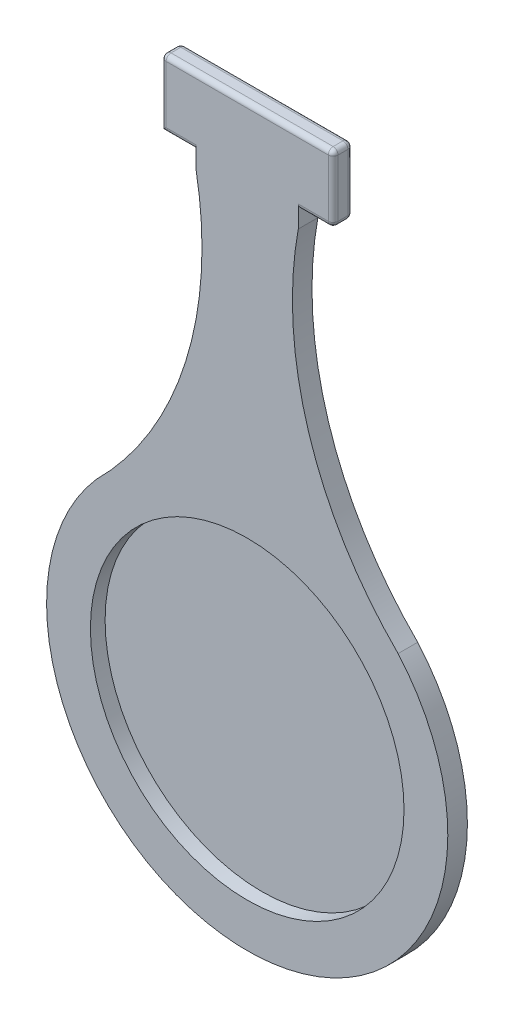
ISO-10303-21;
HEADER;
FILE_DESCRIPTION(('STEP AP214'),'2;1');
FILE_NAME('part.step','',(''),(''),'','','');
FILE_SCHEMA(('AUTOMOTIVE_DESIGN { 1 0 10303 214 1 1 1 1 }'));
ENDSEC;
DATA;
#1=APPLICATION_CONTEXT('core data for automotive mechanical design processes');
#2=APPLICATION_PROTOCOL_DEFINITION('international standard','automotive_design',2000,#1);
#3=PRODUCT_CONTEXT('',#1,'mechanical');
#4=PRODUCT('Part','Part','',(#3));
#5=PRODUCT_RELATED_PRODUCT_CATEGORY('part','',(#4));
#6=PRODUCT_DEFINITION_FORMATION('','',#4);
#7=PRODUCT_DEFINITION_CONTEXT('part definition',#1,'design');
#8=PRODUCT_DEFINITION('design','',#6,#7);
#9=PRODUCT_DEFINITION_SHAPE('','',#8);
#10=(LENGTH_UNIT() NAMED_UNIT(*) SI_UNIT(.MILLI.,.METRE.));
#11=(NAMED_UNIT(*) PLANE_ANGLE_UNIT() SI_UNIT($,.RADIAN.));
#12=(NAMED_UNIT(*) SI_UNIT($,.STERADIAN.) SOLID_ANGLE_UNIT());
#13=UNCERTAINTY_MEASURE_WITH_UNIT(LENGTH_MEASURE(1.E-05),#10,'distance_accuracy_value','');
#14=(GEOMETRIC_REPRESENTATION_CONTEXT(3) GLOBAL_UNCERTAINTY_ASSIGNED_CONTEXT((#13)) GLOBAL_UNIT_ASSIGNED_CONTEXT((#10,
#11,#12)) REPRESENTATION_CONTEXT('',''));
#15=CARTESIAN_POINT('',(0.,0.,0.));
#16=DIRECTION('',(0.,0.,1.));
#17=DIRECTION('',(1.,0.,0.));
#18=AXIS2_PLACEMENT_3D('',#15,#16,#17);
#19=CARTESIAN_POINT('',(81.9477550151051,78.6670750611456,4.));
#20=DIRECTION('',(0.,0.,-1.));
#21=DIRECTION('',(-1.,0.,0.));
#22=AXIS2_PLACEMENT_3D('',#19,#20,#21);
#23=CYLINDRICAL_SURFACE('',#22,72.7227759277008);
#24=CARTESIAN_POINT('',(81.9477550151051,78.6670750611456,0.));
#25=DIRECTION('',(0.,0.,-1.));
#26=DIRECTION('',(-1.,0.,0.));
#27=AXIS2_PLACEMENT_3D('',#24,#25,#26);
#28=CIRCLE('',#27,72.7227759277008);
#29=CARTESIAN_POINT('',(30.7940028537095,26.9766912509909,0.));
#30=VERTEX_POINT('',#29);
#31=CARTESIAN_POINT('',(10.4264337058282,91.8315247954017,0.));
#32=VERTEX_POINT('',#31);
#33=EDGE_CURVE('E195',#30,#32,#28,.T.);
#34=ORIENTED_EDGE('',*,*,#33,.T.);
#35=DIRECTION('',(0.,0.,-1.));
#36=VECTOR('',#35,1.);
#37=CARTESIAN_POINT('',(10.4264337058282,91.8315247954017,4.));
#38=LINE('',#37,#36);
#39=CARTESIAN_POINT('',(10.4264337058282,91.8315247954017,4.));
#40=VERTEX_POINT('',#39);
#41=EDGE_CURVE('E174',#40,#32,#38,.T.);
#42=ORIENTED_EDGE('',*,*,#41,.F.);
#43=CARTESIAN_POINT('',(81.9477550151051,78.6670750611456,4.));
#44=DIRECTION('',(0.,0.,-1.));
#45=DIRECTION('',(-1.,0.,0.));
#46=AXIS2_PLACEMENT_3D('',#43,#44,#45);
#47=CIRCLE('',#46,72.7227759277008);
#48=CARTESIAN_POINT('',(30.7940028537095,26.9766912509909,4.));
#49=VERTEX_POINT('',#48);
#50=EDGE_CURVE('E182',#49,#40,#47,.T.);
#51=ORIENTED_EDGE('',*,*,#50,.F.);
#52=DIRECTION('',(0.,0.,-1.));
#53=VECTOR('',#52,1.);
#54=CARTESIAN_POINT('',(30.7940028537095,26.9766912509909,4.));
#55=LINE('',#54,#53);
#56=EDGE_CURVE('E358',#49,#30,#55,.T.);
#57=ORIENTED_EDGE('',*,*,#56,.T.);
#58=EDGE_LOOP('',(#34,#42,#51,#57));
#59=FACE_BOUND('',#58,.T.);
#60=ADVANCED_FACE('F37',(#59),#23,.F.);
#61=CARTESIAN_POINT('',(10.4264337058282,91.8315247954017,4.));
#62=DIRECTION('',(-1.,0.,0.));
#63=DIRECTION('',(0.,-1.,0.));
#64=AXIS2_PLACEMENT_3D('',#61,#62,#63);
#65=PLANE('',#64);
#66=DIRECTION('',(0.,1.,0.));
#67=VECTOR('',#66,1.);
#68=CARTESIAN_POINT('',(10.4264337058282,91.8315247954017,0.));
#69=LINE('',#68,#67);
#70=CARTESIAN_POINT('',(10.4264337058282,96.2580756220526,0.));
#71=VERTEX_POINT('',#70);
#72=EDGE_CURVE('E346',#32,#71,#69,.T.);
#73=ORIENTED_EDGE('',*,*,#72,.T.);
#74=CARTESIAN_POINT('',(10.4264337058282,96.2580756220526,1.));
#75=DIRECTION('',(-1.,0.,0.));
#76=DIRECTION('',(0.,-1.,0.));
#77=AXIS2_PLACEMENT_3D('',#74,#75,#76);
#78=CIRCLE('',#77,1.);
#79=CARTESIAN_POINT('',(10.4264337058282,95.2580756220526,1.));
#80=VERTEX_POINT('',#79);
#81=EDGE_CURVE('E260',#71,#80,#78,.T.);
#82=ORIENTED_EDGE('',*,*,#81,.T.);
#83=DIRECTION('',(0.,0.,-1.));
#84=VECTOR('',#83,1.);
#85=CARTESIAN_POINT('',(10.4264337058282,95.2580756220526,4.));
#86=LINE('',#85,#84);
#87=CARTESIAN_POINT('',(10.4264337058282,95.2580756220526,3.));
#88=VERTEX_POINT('',#87);
#89=EDGE_CURVE('E197',#88,#80,#86,.T.);
#90=ORIENTED_EDGE('',*,*,#89,.F.);
#91=CARTESIAN_POINT('',(10.4264337058282,96.2580756220526,3.));
#92=DIRECTION('',(-1.,0.,0.));
#93=DIRECTION('',(0.,-1.,0.));
#94=AXIS2_PLACEMENT_3D('',#91,#92,#93);
#95=CIRCLE('',#94,1.);
#96=CARTESIAN_POINT('',(10.4264337058282,96.2580756220526,4.));
#97=VERTEX_POINT('',#96);
#98=EDGE_CURVE('E178',#88,#97,#95,.T.);
#99=ORIENTED_EDGE('',*,*,#98,.T.);
#100=DIRECTION('',(0.,1.,0.));
#101=VECTOR('',#100,1.);
#102=CARTESIAN_POINT('',(10.4264337058282,91.8315247954017,4.));
#103=LINE('',#102,#101);
#104=EDGE_CURVE('E170',#40,#97,#103,.T.);
#105=ORIENTED_EDGE('',*,*,#104,.F.);
#106=ORIENTED_EDGE('',*,*,#41,.T.);
#107=EDGE_LOOP('',(#73,#82,#90,#99,#105,#106));
#108=FACE_BOUND('',#107,.T.);
#109=ADVANCED_FACE('F172',(#108),#65,.F.);
#110=CARTESIAN_POINT('',(10.4264337058282,95.2580756220526,4.));
#111=DIRECTION('',(0.,1.,0.));
#112=DIRECTION('',(0.,0.,1.));
#113=AXIS2_PLACEMENT_3D('',#110,#111,#112);
#114=PLANE('',#113);
#115=ORIENTED_EDGE('',*,*,#89,.T.);
#116=DIRECTION('',(1.,0.,0.));
#117=VECTOR('',#116,1.);
#118=CARTESIAN_POINT('',(17.5473838536535,95.2580756220526,1.));
#119=LINE('',#118,#117);
#120=CARTESIAN_POINT('',(16.5473838536535,95.2580756220526,1.));
#121=VERTEX_POINT('',#120);
#122=EDGE_CURVE('E236',#80,#121,#119,.T.);
#123=ORIENTED_EDGE('',*,*,#122,.T.);
#124=DIRECTION('',(0.,0.,-1.));
#125=VECTOR('',#124,1.);
#126=CARTESIAN_POINT('',(16.5473838536535,95.2580756220526,4.));
#127=LINE('',#126,#125);
#128=CARTESIAN_POINT('',(16.5473838536535,95.2580756220526,3.));
#129=VERTEX_POINT('',#128);
#130=EDGE_CURVE('E232',#121,#129,#127,.F.);
#131=ORIENTED_EDGE('',*,*,#130,.T.);
#132=DIRECTION('',(1.,0.,0.));
#133=VECTOR('',#132,1.);
#134=CARTESIAN_POINT('',(10.4264337058282,95.2580756220526,3.));
#135=LINE('',#134,#133);
#136=EDGE_CURVE('E234',#129,#88,#135,.F.);
#137=ORIENTED_EDGE('',*,*,#136,.T.);
#138=EDGE_LOOP('',(#115,#123,#131,#137));
#139=FACE_BOUND('',#138,.T.);
#140=ADVANCED_FACE('F424',(#139),#114,.F.);
#141=CARTESIAN_POINT('',(17.5473838536535,108.96103692776,4.));
#142=DIRECTION('',(-1.,0.,0.));
#143=DIRECTION('',(0.,0.,1.));
#144=AXIS2_PLACEMENT_3D('',#141,#142,#143);
#145=PLANE('',#144);
#146=DIRECTION('',(0.,1.,0.));
#147=VECTOR('',#146,1.);
#148=CARTESIAN_POINT('',(17.5473838536535,108.96103692776,1.));
#149=LINE('',#148,#147);
#150=CARTESIAN_POINT('',(17.5473838536535,96.2580756220526,1.));
#151=VERTEX_POINT('',#150);
#152=CARTESIAN_POINT('',(17.5473838536535,107.96103692776,1.));
#153=VERTEX_POINT('',#152);
#154=EDGE_CURVE('E243',#151,#153,#149,.T.);
#155=ORIENTED_EDGE('',*,*,#154,.T.);
#156=DIRECTION('',(0.,0.,-1.));
#157=VECTOR('',#156,1.);
#158=CARTESIAN_POINT('',(17.5473838536535,107.96103692776,4.));
#159=LINE('',#158,#157);
#160=CARTESIAN_POINT('',(17.5473838536535,107.96103692776,3.));
#161=VERTEX_POINT('',#160);
#162=EDGE_CURVE('E11',#153,#161,#159,.F.);
#163=ORIENTED_EDGE('',*,*,#162,.T.);
#164=DIRECTION('',(0.,1.,0.));
#165=VECTOR('',#164,1.);
#166=CARTESIAN_POINT('',(17.5473838536535,108.96103692776,3.));
#167=LINE('',#166,#165);
#168=CARTESIAN_POINT('',(17.5473838536535,96.2580756220526,3.));
#169=VERTEX_POINT('',#168);
#170=EDGE_CURVE('E247',#161,#169,#167,.F.);
#171=ORIENTED_EDGE('',*,*,#170,.T.);
#172=DIRECTION('',(0.,0.,-1.));
#173=VECTOR('',#172,1.);
#174=CARTESIAN_POINT('',(17.5473838536535,96.2580756220526,4.));
#175=LINE('',#174,#173);
#176=EDGE_CURVE('E245',#169,#151,#175,.T.);
#177=ORIENTED_EDGE('',*,*,#176,.T.);
#178=EDGE_LOOP('',(#155,#163,#171,#177));
#179=FACE_BOUND('',#178,.T.);
#180=ADVANCED_FACE('F417',(#179),#145,.F.);
#181=CARTESIAN_POINT('',(-17.5473838536535,108.96103692776,4.));
#182=DIRECTION('',(0.,-1.,0.));
#183=DIRECTION('',(0.,0.,-1.));
#184=AXIS2_PLACEMENT_3D('',#181,#182,#183);
#185=PLANE('',#184);
#186=DIRECTION('',(-1.,0.,0.));
#187=VECTOR('',#186,1.);
#188=CARTESIAN_POINT('',(-17.5473838536535,108.96103692776,1.));
#189=LINE('',#188,#187);
#190=CARTESIAN_POINT('',(16.5473838536535,108.96103692776,1.));
#191=VERTEX_POINT('',#190);
#192=CARTESIAN_POINT('',(-16.5473838536535,108.96103692776,1.));
#193=VERTEX_POINT('',#192);
#194=EDGE_CURVE('E252',#191,#193,#189,.T.);
#195=ORIENTED_EDGE('',*,*,#194,.T.);
#196=DIRECTION('',(0.,0.,-1.));
#197=VECTOR('',#196,1.);
#198=CARTESIAN_POINT('',(-16.5473838536535,108.96103692776,4.));
#199=LINE('',#198,#197);
#200=CARTESIAN_POINT('',(-16.5473838536535,108.96103692776,3.));
#201=VERTEX_POINT('',#200);
#202=EDGE_CURVE('E46',#193,#201,#199,.F.);
#203=ORIENTED_EDGE('',*,*,#202,.T.);
#204=DIRECTION('',(-1.,0.,0.));
#205=VECTOR('',#204,1.);
#206=CARTESIAN_POINT('',(-17.5473838536535,108.96103692776,3.));
#207=LINE('',#206,#205);
#208=CARTESIAN_POINT('',(16.5473838536535,108.96103692776,3.));
#209=VERTEX_POINT('',#208);
#210=EDGE_CURVE('E249',#201,#209,#207,.F.);
#211=ORIENTED_EDGE('',*,*,#210,.T.);
#212=DIRECTION('',(0.,0.,-1.));
#213=VECTOR('',#212,1.);
#214=CARTESIAN_POINT('',(16.5473838536535,108.96103692776,4.));
#215=LINE('',#214,#213);
#216=EDGE_CURVE('E308',#209,#191,#215,.T.);
#217=ORIENTED_EDGE('',*,*,#216,.T.);
#218=EDGE_LOOP('',(#195,#203,#211,#217));
#219=FACE_BOUND('',#218,.T.);
#220=ADVANCED_FACE('F396',(#219),#185,.F.);
#221=CARTESIAN_POINT('',(-17.5473838536535,108.96103692776,4.));
#222=DIRECTION('',(1.,0.,0.));
#223=DIRECTION('',(0.,0.,-1.));
#224=AXIS2_PLACEMENT_3D('',#221,#222,#223);
#225=PLANE('',#224);
#226=DIRECTION('',(0.,-1.,0.));
#227=VECTOR('',#226,1.);
#228=CARTESIAN_POINT('',(-17.5473838536535,108.96103692776,3.));
#229=LINE('',#228,#227);
#230=CARTESIAN_POINT('',(-17.5473838536535,95.2580756220526,3.));
#231=VERTEX_POINT('',#230);
#232=CARTESIAN_POINT('',(-17.5473838536535,107.96103692776,3.));
#233=VERTEX_POINT('',#232);
#234=EDGE_CURVE('E238',#231,#233,#229,.F.);
#235=ORIENTED_EDGE('',*,*,#234,.T.);
#236=DIRECTION('',(0.,0.,-1.));
#237=VECTOR('',#236,1.);
#238=CARTESIAN_POINT('',(-17.5473838536535,107.96103692776,4.));
#239=LINE('',#238,#237);
#240=CARTESIAN_POINT('',(-17.5473838536535,107.96103692776,1.));
#241=VERTEX_POINT('',#240);
#242=EDGE_CURVE('E306',#233,#241,#239,.T.);
#243=ORIENTED_EDGE('',*,*,#242,.T.);
#244=DIRECTION('',(0.,-1.,0.));
#245=VECTOR('',#244,1.);
#246=CARTESIAN_POINT('',(-17.5473838536535,95.2580756220526,1.));
#247=LINE('',#246,#245);
#248=CARTESIAN_POINT('',(-17.5473838536535,95.2580756220526,1.));
#249=VERTEX_POINT('',#248);
#250=EDGE_CURVE('E241',#241,#249,#247,.T.);
#251=ORIENTED_EDGE('',*,*,#250,.T.);
#252=DIRECTION('',(0.,0.,-1.));
#253=VECTOR('',#252,1.);
#254=CARTESIAN_POINT('',(-17.5473838536535,95.2580756220526,4.));
#255=LINE('',#254,#253);
#256=EDGE_CURVE('E203',#231,#249,#255,.T.);
#257=ORIENTED_EDGE('',*,*,#256,.F.);
#258=EDGE_LOOP('',(#235,#243,#251,#257));
#259=FACE_BOUND('',#258,.T.);
#260=ADVANCED_FACE('F408',(#259),#225,.F.);
#261=CARTESIAN_POINT('',(-17.5473838536535,95.2580756220526,4.));
#262=DIRECTION('',(0.,1.,0.));
#263=DIRECTION('',(0.,0.,1.));
#264=AXIS2_PLACEMENT_3D('',#261,#262,#263);
#265=PLANE('',#264);
#266=DIRECTION('',(0.,0.,-1.));
#267=VECTOR('',#266,1.);
#268=CARTESIAN_POINT('',(-10.4264337058282,95.2580756220526,4.));
#269=LINE('',#268,#267);
#270=CARTESIAN_POINT('',(-10.4264337058282,95.2580756220526,3.));
#271=VERTEX_POINT('',#270);
#272=CARTESIAN_POINT('',(-10.4264337058282,95.2580756220526,1.));
#273=VERTEX_POINT('',#272);
#274=EDGE_CURVE('E366',#271,#273,#269,.T.);
#275=ORIENTED_EDGE('',*,*,#274,.F.);
#276=DIRECTION('',(1.,0.,0.));
#277=VECTOR('',#276,1.);
#278=CARTESIAN_POINT('',(-17.5473838536535,95.2580756220526,3.));
#279=LINE('',#278,#277);
#280=EDGE_CURVE('E217',#271,#231,#279,.F.);
#281=ORIENTED_EDGE('',*,*,#280,.T.);
#282=ORIENTED_EDGE('',*,*,#256,.T.);
#283=DIRECTION('',(1.,0.,0.));
#284=VECTOR('',#283,1.);
#285=CARTESIAN_POINT('',(-10.4264337058282,95.2580756220526,1.));
#286=LINE('',#285,#284);
#287=EDGE_CURVE('E215',#249,#273,#286,.T.);
#288=ORIENTED_EDGE('',*,*,#287,.T.);
#289=EDGE_LOOP('',(#275,#281,#282,#288));
#290=FACE_BOUND('',#289,.T.);
#291=ADVANCED_FACE('F373',(#290),#265,.F.);
#292=CARTESIAN_POINT('',(-10.4264337058282,91.8315247954017,4.));
#293=DIRECTION('',(1.,0.,0.));
#294=DIRECTION('',(0.,0.,-1.));
#295=AXIS2_PLACEMENT_3D('',#292,#293,#294);
#296=PLANE('',#295);
#297=DIRECTION('',(0.,-1.,0.));
#298=VECTOR('',#297,1.);
#299=CARTESIAN_POINT('',(-10.4264337058282,91.8315247954017,0.));
#300=LINE('',#299,#298);
#301=CARTESIAN_POINT('',(-10.4264337058282,96.2580756220526,0.));
#302=VERTEX_POINT('',#301);
#303=CARTESIAN_POINT('',(-10.4264337058282,91.8315247954017,0.));
#304=VERTEX_POINT('',#303);
#305=EDGE_CURVE('E348',#302,#304,#300,.T.);
#306=ORIENTED_EDGE('',*,*,#305,.T.);
#307=DIRECTION('',(0.,0.,-1.));
#308=VECTOR('',#307,1.);
#309=CARTESIAN_POINT('',(-10.4264337058282,91.8315247954017,4.));
#310=LINE('',#309,#308);
#311=CARTESIAN_POINT('',(-10.4264337058282,91.8315247954017,4.));
#312=VERTEX_POINT('',#311);
#313=EDGE_CURVE('E363',#312,#304,#310,.T.);
#314=ORIENTED_EDGE('',*,*,#313,.F.);
#315=DIRECTION('',(0.,-1.,0.));
#316=VECTOR('',#315,1.);
#317=CARTESIAN_POINT('',(-10.4264337058282,91.8315247954017,4.));
#318=LINE('',#317,#316);
#319=CARTESIAN_POINT('',(-10.4264337058282,96.2580756220526,4.));
#320=VERTEX_POINT('',#319);
#321=EDGE_CURVE('E181',#320,#312,#318,.T.);
#322=ORIENTED_EDGE('',*,*,#321,.F.);
#323=CARTESIAN_POINT('',(-10.4264337058282,96.2580756220526,3.));
#324=DIRECTION('',(1.,0.,0.));
#325=DIRECTION('',(0.,0.,-1.));
#326=AXIS2_PLACEMENT_3D('',#323,#324,#325);
#327=CIRCLE('',#326,1.);
#328=EDGE_CURVE('E255',#320,#271,#327,.T.);
#329=ORIENTED_EDGE('',*,*,#328,.T.);
#330=ORIENTED_EDGE('',*,*,#274,.T.);
#331=CARTESIAN_POINT('',(-10.4264337058282,96.2580756220526,1.));
#332=DIRECTION('',(1.,0.,0.));
#333=DIRECTION('',(0.,0.,-1.));
#334=AXIS2_PLACEMENT_3D('',#331,#332,#333);
#335=CIRCLE('',#334,1.);
#336=EDGE_CURVE('E257',#273,#302,#335,.T.);
#337=ORIENTED_EDGE('',*,*,#336,.T.);
#338=EDGE_LOOP('',(#306,#314,#322,#329,#330,#337));
#339=FACE_BOUND('',#338,.T.);
#340=ADVANCED_FACE('F415',(#339),#296,.F.);
#341=CARTESIAN_POINT('',(-81.9477550151051,78.6670750611456,4.));
#342=DIRECTION('',(0.,0.,-1.));
#343=DIRECTION('',(-1.,0.,0.));
#344=AXIS2_PLACEMENT_3D('',#341,#342,#343);
#345=CYLINDRICAL_SURFACE('',#344,72.7227759277008);
#346=CARTESIAN_POINT('',(-81.9477550151051,78.6670750611456,0.));
#347=DIRECTION('',(0.,0.,-1.));
#348=DIRECTION('',(1.,0.,0.));
#349=AXIS2_PLACEMENT_3D('',#346,#347,#348);
#350=CIRCLE('',#349,72.7227759277008);
#351=CARTESIAN_POINT('',(-30.7940028537096,26.9766912509909,0.));
#352=VERTEX_POINT('',#351);
#353=EDGE_CURVE('E350',#304,#352,#350,.T.);
#354=ORIENTED_EDGE('',*,*,#353,.T.);
#355=DIRECTION('',(0.,0.,-1.));
#356=VECTOR('',#355,1.);
#357=CARTESIAN_POINT('',(-30.7940028537096,26.9766912509909,4.));
#358=LINE('',#357,#356);
#359=CARTESIAN_POINT('',(-30.7940028537096,26.9766912509909,4.));
#360=VERTEX_POINT('',#359);
#361=EDGE_CURVE('E360',#360,#352,#358,.T.);
#362=ORIENTED_EDGE('',*,*,#361,.F.);
#363=CARTESIAN_POINT('',(-81.9477550151051,78.6670750611456,4.));
#364=DIRECTION('',(0.,0.,-1.));
#365=DIRECTION('',(1.,0.,0.));
#366=AXIS2_PLACEMENT_3D('',#363,#364,#365);
#367=CIRCLE('',#366,72.7227759277008);
#368=EDGE_CURVE('E648',#312,#360,#367,.T.);
#369=ORIENTED_EDGE('',*,*,#368,.F.);
#370=ORIENTED_EDGE('',*,*,#313,.T.);
#371=EDGE_LOOP('',(#354,#362,#369,#370));
#372=FACE_BOUND('',#371,.T.);
#373=ADVANCED_FACE('F581',(#372),#345,.F.);
#374=CARTESIAN_POINT('',(0.,0.,4.));
#375=DIRECTION('',(0.,0.,-1.));
#376=DIRECTION('',(-1.,0.,0.));
#377=AXIS2_PLACEMENT_3D('',#374,#375,#376);
#378=CYLINDRICAL_SURFACE('',#377,40.9391314344303);
#379=CARTESIAN_POINT('',(0.,0.,0.));
#380=DIRECTION('',(0.,0.,1.));
#381=DIRECTION('',(1.,0.,0.));
#382=AXIS2_PLACEMENT_3D('',#379,#380,#381);
#383=CIRCLE('',#382,40.9391314344303);
#384=EDGE_CURVE('E192',#352,#30,#383,.T.);
#385=ORIENTED_EDGE('',*,*,#384,.T.);
#386=ORIENTED_EDGE('',*,*,#56,.F.);
#387=CARTESIAN_POINT('',(0.,0.,4.));
#388=DIRECTION('',(0.,0.,1.));
#389=DIRECTION('',(1.,0.,0.));
#390=AXIS2_PLACEMENT_3D('',#387,#388,#389);
#391=CIRCLE('',#390,40.9391314344303);
#392=EDGE_CURVE('E188',#360,#49,#391,.T.);
#393=ORIENTED_EDGE('',*,*,#392,.F.);
#394=ORIENTED_EDGE('',*,*,#361,.T.);
#395=EDGE_LOOP('',(#385,#386,#393,#394));
#396=FACE_BOUND('',#395,.T.);
#397=ADVANCED_FACE('F574',(#396),#378,.T.);
#398=CARTESIAN_POINT('',(81.9477550151051,78.6670750611456,4.));
#399=DIRECTION('',(0.,0.,-1.));
#400=DIRECTION('',(-1.,0.,0.));
#401=AXIS2_PLACEMENT_3D('',#398,#399,#400);
#402=PLANE('',#401);
#403=CARTESIAN_POINT('',(0.,0.,4.));
#404=DIRECTION('',(0.,0.,1.));
#405=DIRECTION('',(1.,0.,0.));
#406=AXIS2_PLACEMENT_3D('',#403,#404,#405);
#407=CIRCLE('',#406,32.);
#408=CARTESIAN_POINT('',(32.,0.,4.));
#409=VERTEX_POINT('',#408);
#410=EDGE_CURVE('E289',#409,#409,#407,.T.);
#411=ORIENTED_EDGE('',*,*,#410,.F.);
#412=EDGE_LOOP('',(#411));
#413=FACE_BOUND('',#412,.T.);
#414=DIRECTION('',(1.,0.,0.));
#415=VECTOR('',#414,1.);
#416=CARTESIAN_POINT('',(81.9477550151051,96.2580756220526,4.));
#417=LINE('',#416,#415);
#418=CARTESIAN_POINT('',(-16.5473838536535,96.2580756220526,4.));
#419=VERTEX_POINT('',#418);
#420=EDGE_CURVE('E213',#419,#320,#417,.T.);
#421=ORIENTED_EDGE('',*,*,#420,.T.);
#422=ORIENTED_EDGE('',*,*,#321,.T.);
#423=ORIENTED_EDGE('',*,*,#368,.T.);
#424=ORIENTED_EDGE('',*,*,#392,.T.);
#425=ORIENTED_EDGE('',*,*,#50,.T.);
#426=ORIENTED_EDGE('',*,*,#104,.T.);
#427=DIRECTION('',(1.,0.,0.));
#428=VECTOR('',#427,1.);
#429=CARTESIAN_POINT('',(81.9477550151051,96.2580756220526,4.));
#430=LINE('',#429,#428);
#431=CARTESIAN_POINT('',(16.5473838536535,96.2580756220526,4.));
#432=VERTEX_POINT('',#431);
#433=EDGE_CURVE('E211',#97,#432,#430,.T.);
#434=ORIENTED_EDGE('',*,*,#433,.T.);
#435=DIRECTION('',(0.,1.,0.));
#436=VECTOR('',#435,1.);
#437=CARTESIAN_POINT('',(16.5473838536535,78.6670750611456,4.));
#438=LINE('',#437,#436);
#439=CARTESIAN_POINT('',(16.5473838536535,107.96103692776,4.));
#440=VERTEX_POINT('',#439);
#441=EDGE_CURVE('E196',#432,#440,#438,.T.);
#442=ORIENTED_EDGE('',*,*,#441,.T.);
#443=DIRECTION('',(-1.,0.,0.));
#444=VECTOR('',#443,1.);
#445=CARTESIAN_POINT('',(81.9477550151051,107.96103692776,4.));
#446=LINE('',#445,#444);
#447=CARTESIAN_POINT('',(-16.5473838536535,107.96103692776,4.));
#448=VERTEX_POINT('',#447);
#449=EDGE_CURVE('E200',#440,#448,#446,.T.);
#450=ORIENTED_EDGE('',*,*,#449,.T.);
#451=DIRECTION('',(0.,-1.,0.));
#452=VECTOR('',#451,1.);
#453=CARTESIAN_POINT('',(-16.5473838536535,78.6670750611456,4.));
#454=LINE('',#453,#452);
#455=EDGE_CURVE('E209',#448,#419,#454,.T.);
#456=ORIENTED_EDGE('',*,*,#455,.T.);
#457=EDGE_LOOP('',(#421,#422,#423,#424,#425,#426,#434,#442,#450,#456));
#458=FACE_BOUND('',#457,.T.);
#459=ADVANCED_FACE('F186',(#413,#458),#402,.F.);
#460=CARTESIAN_POINT('',(81.9477550151051,78.6670750611456,0.));
#461=DIRECTION('',(0.,0.,-1.));
#462=DIRECTION('',(-1.,0.,0.));
#463=AXIS2_PLACEMENT_3D('',#460,#461,#462);
#464=PLANE('',#463);
#465=DIRECTION('',(1.,0.,0.));
#466=VECTOR('',#465,1.);
#467=CARTESIAN_POINT('',(10.4264337058282,96.2580756220526,0.));
#468=LINE('',#467,#466);
#469=CARTESIAN_POINT('',(16.5473838536535,96.2580756220526,0.));
#470=VERTEX_POINT('',#469);
#471=EDGE_CURVE('E227',#470,#71,#468,.F.);
#472=ORIENTED_EDGE('',*,*,#471,.T.);
#473=ORIENTED_EDGE('',*,*,#72,.F.);
#474=ORIENTED_EDGE('',*,*,#33,.F.);
#475=ORIENTED_EDGE('',*,*,#384,.F.);
#476=ORIENTED_EDGE('',*,*,#353,.F.);
#477=ORIENTED_EDGE('',*,*,#305,.F.);
#478=DIRECTION('',(1.,0.,0.));
#479=VECTOR('',#478,1.);
#480=CARTESIAN_POINT('',(-17.5473838536535,96.2580756220526,0.));
#481=LINE('',#480,#479);
#482=CARTESIAN_POINT('',(-16.5473838536535,96.2580756220526,0.));
#483=VERTEX_POINT('',#482);
#484=EDGE_CURVE('E230',#302,#483,#481,.F.);
#485=ORIENTED_EDGE('',*,*,#484,.T.);
#486=DIRECTION('',(0.,-1.,0.));
#487=VECTOR('',#486,1.);
#488=CARTESIAN_POINT('',(-16.5473838536535,108.96103692776,0.));
#489=LINE('',#488,#487);
#490=CARTESIAN_POINT('',(-16.5473838536535,107.96103692776,0.));
#491=VERTEX_POINT('',#490);
#492=EDGE_CURVE('E224',#483,#491,#489,.F.);
#493=ORIENTED_EDGE('',*,*,#492,.T.);
#494=DIRECTION('',(-1.,0.,0.));
#495=VECTOR('',#494,1.);
#496=CARTESIAN_POINT('',(17.5473838536535,107.96103692776,0.));
#497=LINE('',#496,#495);
#498=CARTESIAN_POINT('',(16.5473838536535,107.96103692776,0.));
#499=VERTEX_POINT('',#498);
#500=EDGE_CURVE('E221',#491,#499,#497,.F.);
#501=ORIENTED_EDGE('',*,*,#500,.T.);
#502=DIRECTION('',(0.,1.,0.));
#503=VECTOR('',#502,1.);
#504=CARTESIAN_POINT('',(16.5473838536535,95.2580756220526,0.));
#505=LINE('',#504,#503);
#506=EDGE_CURVE('E219',#499,#470,#505,.F.);
#507=ORIENTED_EDGE('',*,*,#506,.T.);
#508=EDGE_LOOP('',(#472,#473,#474,#475,#476,#477,#485,#493,#501,#507));
#509=FACE_BOUND('',#508,.T.);
#510=ADVANCED_FACE('F332',(#509),#464,.T.);
#511=CARTESIAN_POINT('',(0.,0.,1.));
#512=DIRECTION('',(0.,0.,1.));
#513=DIRECTION('',(1.,0.,0.));
#514=AXIS2_PLACEMENT_3D('',#511,#512,#513);
#515=CYLINDRICAL_SURFACE('',#514,32.);
#516=CARTESIAN_POINT('',(0.,0.,1.));
#517=DIRECTION('',(0.,0.,1.));
#518=DIRECTION('',(1.,0.,0.));
#519=AXIS2_PLACEMENT_3D('',#516,#517,#518);
#520=CIRCLE('',#519,32.);
#521=CARTESIAN_POINT('',(32.,0.,1.));
#522=VERTEX_POINT('',#521);
#523=EDGE_CURVE('E352',#522,#522,#520,.T.);
#524=ORIENTED_EDGE('',*,*,#523,.F.);
#525=EDGE_LOOP('',(#524));
#526=FACE_BOUND('',#525,.T.);
#527=ORIENTED_EDGE('',*,*,#410,.T.);
#528=EDGE_LOOP('',(#527));
#529=FACE_BOUND('',#528,.T.);
#530=ADVANCED_FACE('F552',(#526,#529),#515,.F.);
#531=CARTESIAN_POINT('',(0.,0.,1.));
#532=DIRECTION('',(0.,0.,1.));
#533=DIRECTION('',(1.,0.,0.));
#534=AXIS2_PLACEMENT_3D('',#531,#532,#533);
#535=PLANE('',#534);
#536=ORIENTED_EDGE('',*,*,#523,.T.);
#537=EDGE_LOOP('',(#536));
#538=FACE_BOUND('',#537,.T.);
#539=ADVANCED_FACE('F464',(#538),#535,.T.);
#540=CARTESIAN_POINT('',(-17.5473838536535,96.2580756220526,1.));
#541=DIRECTION('',(-1.,0.,0.));
#542=DIRECTION('',(0.,0.,1.));
#543=AXIS2_PLACEMENT_3D('',#540,#541,#542);
#544=CYLINDRICAL_SURFACE('',#543,1.);
#545=ORIENTED_EDGE('',*,*,#336,.F.);
#546=ORIENTED_EDGE('',*,*,#287,.F.);
#547=CARTESIAN_POINT('',(-16.5473838536535,96.2580756220526,1.));
#548=DIRECTION('',(-0.707106781186547,0.707106781186547,0.));
#549=DIRECTION('',(0.707106781186547,0.707106781186547,0.));
#550=AXIS2_PLACEMENT_3D('',#547,#548,#549);
#551=ELLIPSE('',#550,1.41421356237309,1.);
#552=EDGE_CURVE('E286',#483,#249,#551,.T.);
#553=ORIENTED_EDGE('',*,*,#552,.F.);
#554=ORIENTED_EDGE('',*,*,#484,.F.);
#555=EDGE_LOOP('',(#545,#546,#553,#554));
#556=FACE_BOUND('',#555,.T.);
#557=ADVANCED_FACE('F380',(#556),#544,.T.);
#558=CARTESIAN_POINT('',(-16.5473838536535,108.96103692776,1.));
#559=DIRECTION('',(0.,1.,0.));
#560=DIRECTION('',(0.,0.,1.));
#561=AXIS2_PLACEMENT_3D('',#558,#559,#560);
#562=CYLINDRICAL_SURFACE('',#561,1.);
#563=ORIENTED_EDGE('',*,*,#250,.F.);
#564=CARTESIAN_POINT('',(-16.5473838536535,107.96103692776,1.));
#565=DIRECTION('',(0.,1.,0.));
#566=DIRECTION('',(0.,0.,1.));
#567=AXIS2_PLACEMENT_3D('',#564,#565,#566);
#568=CIRCLE('',#567,1.);
#569=EDGE_CURVE('E301',#241,#491,#568,.F.);
#570=ORIENTED_EDGE('',*,*,#569,.T.);
#571=ORIENTED_EDGE('',*,*,#492,.F.);
#572=ORIENTED_EDGE('',*,*,#552,.T.);
#573=EDGE_LOOP('',(#563,#570,#571,#572));
#574=FACE_BOUND('',#573,.T.);
#575=ADVANCED_FACE('F384',(#574),#562,.T.);
#576=CARTESIAN_POINT('',(-17.5473838536535,107.96103692776,1.));
#577=DIRECTION('',(1.,0.,0.));
#578=DIRECTION('',(0.,0.,-1.));
#579=AXIS2_PLACEMENT_3D('',#576,#577,#578);
#580=CYLINDRICAL_SURFACE('',#579,1.);
#581=ORIENTED_EDGE('',*,*,#500,.F.);
#582=CARTESIAN_POINT('',(-16.5473838536535,107.96103692776,1.));
#583=DIRECTION('',(1.,0.,0.));
#584=DIRECTION('',(0.,0.,-1.));
#585=AXIS2_PLACEMENT_3D('',#582,#583,#584);
#586=CIRCLE('',#585,1.);
#587=EDGE_CURVE('E299',#491,#193,#586,.T.);
#588=ORIENTED_EDGE('',*,*,#587,.T.);
#589=ORIENTED_EDGE('',*,*,#194,.F.);
#590=CARTESIAN_POINT('',(16.5473838536535,107.96103692776,1.));
#591=DIRECTION('',(1.,0.,0.));
#592=DIRECTION('',(0.,0.,-1.));
#593=AXIS2_PLACEMENT_3D('',#590,#591,#592);
#594=CIRCLE('',#593,1.);
#595=EDGE_CURVE('E297',#191,#499,#594,.F.);
#596=ORIENTED_EDGE('',*,*,#595,.T.);
#597=EDGE_LOOP('',(#581,#588,#589,#596));
#598=FACE_BOUND('',#597,.T.);
#599=ADVANCED_FACE('F329',(#598),#580,.T.);
#600=CARTESIAN_POINT('',(16.5473838536535,108.96103692776,1.));
#601=DIRECTION('',(0.,-1.,0.));
#602=DIRECTION('',(0.,0.,-1.));
#603=AXIS2_PLACEMENT_3D('',#600,#601,#602);
#604=CYLINDRICAL_SURFACE('',#603,1.);
#605=ORIENTED_EDGE('',*,*,#506,.F.);
#606=CARTESIAN_POINT('',(16.5473838536535,107.96103692776,1.));
#607=DIRECTION('',(0.,-1.,0.));
#608=DIRECTION('',(0.,0.,-1.));
#609=AXIS2_PLACEMENT_3D('',#606,#607,#608);
#610=CIRCLE('',#609,1.);
#611=EDGE_CURVE('E54',#499,#153,#610,.T.);
#612=ORIENTED_EDGE('',*,*,#611,.T.);
#613=ORIENTED_EDGE('',*,*,#154,.F.);
#614=CARTESIAN_POINT('',(16.5473838536535,96.2580756220526,1.));
#615=DIRECTION('',(0.,-1.,0.));
#616=DIRECTION('',(0.,0.,-1.));
#617=AXIS2_PLACEMENT_3D('',#614,#615,#616);
#618=CIRCLE('',#617,1.);
#619=EDGE_CURVE('E283',#470,#151,#618,.T.);
#620=ORIENTED_EDGE('',*,*,#619,.F.);
#621=EDGE_LOOP('',(#605,#612,#613,#620));
#622=FACE_BOUND('',#621,.T.);
#623=ADVANCED_FACE('F336',(#622),#604,.T.);
#624=CARTESIAN_POINT('',(10.4264337058282,96.2580756220526,1.));
#625=DIRECTION('',(-1.,0.,0.));
#626=DIRECTION('',(0.,0.,1.));
#627=AXIS2_PLACEMENT_3D('',#624,#625,#626);
#628=CYLINDRICAL_SURFACE('',#627,1.);
#629=ORIENTED_EDGE('',*,*,#81,.F.);
#630=ORIENTED_EDGE('',*,*,#471,.F.);
#631=CARTESIAN_POINT('',(16.5473838536535,96.2580756220526,1.));
#632=DIRECTION('',(1.,0.,0.));
#633=DIRECTION('',(0.,0.,-1.));
#634=AXIS2_PLACEMENT_3D('',#631,#632,#633);
#635=CIRCLE('',#634,1.);
#636=EDGE_CURVE('E280',#121,#470,#635,.T.);
#637=ORIENTED_EDGE('',*,*,#636,.F.);
#638=ORIENTED_EDGE('',*,*,#122,.F.);
#639=EDGE_LOOP('',(#629,#630,#637,#638));
#640=FACE_BOUND('',#639,.T.);
#641=ADVANCED_FACE('F345',(#640),#628,.T.);
#642=CARTESIAN_POINT('',(16.5473838536535,96.2580756220526,1.));
#643=DIRECTION('',(0.,0.,1.));
#644=DIRECTION('',(1.,0.,0.));
#645=AXIS2_PLACEMENT_3D('',#642,#643,#644);
#646=SPHERICAL_SURFACE('',#645,1.);
#647=ORIENTED_EDGE('',*,*,#636,.T.);
#648=ORIENTED_EDGE('',*,*,#619,.T.);
#649=CARTESIAN_POINT('',(16.5473838536535,96.2580756220526,1.));
#650=DIRECTION('',(0.,0.,-1.));
#651=DIRECTION('',(-1.,0.,0.));
#652=AXIS2_PLACEMENT_3D('',#649,#650,#651);
#653=CIRCLE('',#652,1.);
#654=EDGE_CURVE('E277',#121,#151,#653,.F.);
#655=ORIENTED_EDGE('',*,*,#654,.F.);
#656=EDGE_LOOP('',(#647,#648,#655));
#657=FACE_BOUND('',#656,.T.);
#658=ADVANCED_FACE('F340',(#657),#646,.T.);
#659=CARTESIAN_POINT('',(16.5473838536535,96.2580756220526,4.));
#660=DIRECTION('',(0.,0.,-1.));
#661=DIRECTION('',(-1.,0.,0.));
#662=AXIS2_PLACEMENT_3D('',#659,#660,#661);
#663=CYLINDRICAL_SURFACE('',#662,1.);
#664=ORIENTED_EDGE('',*,*,#654,.T.);
#665=ORIENTED_EDGE('',*,*,#176,.F.);
#666=CARTESIAN_POINT('',(16.5473838536535,96.2580756220526,3.));
#667=DIRECTION('',(0.,0.,1.));
#668=DIRECTION('',(1.,0.,0.));
#669=AXIS2_PLACEMENT_3D('',#666,#667,#668);
#670=CIRCLE('',#669,1.);
#671=EDGE_CURVE('E274',#129,#169,#670,.T.);
#672=ORIENTED_EDGE('',*,*,#671,.F.);
#673=ORIENTED_EDGE('',*,*,#130,.F.);
#674=EDGE_LOOP('',(#664,#665,#672,#673));
#675=FACE_BOUND('',#674,.T.);
#676=ADVANCED_FACE('F447',(#675),#663,.T.);
#677=CARTESIAN_POINT('',(81.9477550151051,96.2580756220526,3.));
#678=DIRECTION('',(1.,0.,0.));
#679=DIRECTION('',(0.,0.,-1.));
#680=AXIS2_PLACEMENT_3D('',#677,#678,#679);
#681=CYLINDRICAL_SURFACE('',#680,1.);
#682=ORIENTED_EDGE('',*,*,#98,.F.);
#683=ORIENTED_EDGE('',*,*,#136,.F.);
#684=CARTESIAN_POINT('',(16.5473838536535,96.2580756220526,3.));
#685=DIRECTION('',(1.,0.,0.));
#686=DIRECTION('',(0.,0.,-1.));
#687=AXIS2_PLACEMENT_3D('',#684,#685,#686);
#688=CIRCLE('',#687,1.);
#689=EDGE_CURVE('E271',#432,#129,#688,.T.);
#690=ORIENTED_EDGE('',*,*,#689,.F.);
#691=ORIENTED_EDGE('',*,*,#433,.F.);
#692=EDGE_LOOP('',(#682,#683,#690,#691));
#693=FACE_BOUND('',#692,.T.);
#694=ADVANCED_FACE('F443',(#693),#681,.T.);
#695=CARTESIAN_POINT('',(16.5473838536535,96.2580756220526,3.));
#696=DIRECTION('',(0.,0.,1.));
#697=DIRECTION('',(1.,0.,0.));
#698=AXIS2_PLACEMENT_3D('',#695,#696,#697);
#699=SPHERICAL_SURFACE('',#698,1.);
#700=ORIENTED_EDGE('',*,*,#689,.T.);
#701=ORIENTED_EDGE('',*,*,#671,.T.);
#702=CARTESIAN_POINT('',(16.5473838536535,96.2580756220526,3.));
#703=DIRECTION('',(0.,-1.,0.));
#704=DIRECTION('',(0.,0.,-1.));
#705=AXIS2_PLACEMENT_3D('',#702,#703,#704);
#706=CIRCLE('',#705,1.);
#707=EDGE_CURVE('E267',#432,#169,#706,.F.);
#708=ORIENTED_EDGE('',*,*,#707,.F.);
#709=EDGE_LOOP('',(#700,#701,#708));
#710=FACE_BOUND('',#709,.T.);
#711=ADVANCED_FACE('F439',(#710),#699,.T.);
#712=CARTESIAN_POINT('',(16.5473838536535,78.6670750611456,3.));
#713=DIRECTION('',(0.,1.,0.));
#714=DIRECTION('',(0.,0.,1.));
#715=AXIS2_PLACEMENT_3D('',#712,#713,#714);
#716=CYLINDRICAL_SURFACE('',#715,1.);
#717=ORIENTED_EDGE('',*,*,#170,.F.);
#718=CARTESIAN_POINT('',(16.5473838536535,107.96103692776,3.));
#719=DIRECTION('',(0.,1.,0.));
#720=DIRECTION('',(0.,0.,1.));
#721=AXIS2_PLACEMENT_3D('',#718,#719,#720);
#722=CIRCLE('',#721,1.);
#723=EDGE_CURVE('E303',#161,#440,#722,.F.);
#724=ORIENTED_EDGE('',*,*,#723,.T.);
#725=ORIENTED_EDGE('',*,*,#441,.F.);
#726=ORIENTED_EDGE('',*,*,#707,.T.);
#727=EDGE_LOOP('',(#717,#724,#725,#726));
#728=FACE_BOUND('',#727,.T.);
#729=ADVANCED_FACE('F436',(#728),#716,.T.);
#730=CARTESIAN_POINT('',(81.9477550151051,107.96103692776,3.));
#731=DIRECTION('',(-1.,0.,0.));
#732=DIRECTION('',(0.,0.,1.));
#733=AXIS2_PLACEMENT_3D('',#730,#731,#732);
#734=CYLINDRICAL_SURFACE('',#733,1.);
#735=ORIENTED_EDGE('',*,*,#210,.F.);
#736=CARTESIAN_POINT('',(-16.5473838536535,107.96103692776,3.));
#737=DIRECTION('',(-1.,0.,0.));
#738=DIRECTION('',(0.,0.,1.));
#739=AXIS2_PLACEMENT_3D('',#736,#737,#738);
#740=CIRCLE('',#739,1.);
#741=EDGE_CURVE('E295',#201,#448,#740,.F.);
#742=ORIENTED_EDGE('',*,*,#741,.T.);
#743=ORIENTED_EDGE('',*,*,#449,.F.);
#744=CARTESIAN_POINT('',(16.5473838536535,107.96103692776,3.));
#745=DIRECTION('',(-1.,0.,0.));
#746=DIRECTION('',(0.,0.,1.));
#747=AXIS2_PLACEMENT_3D('',#744,#745,#746);
#748=CIRCLE('',#747,1.);
#749=EDGE_CURVE('E292',#440,#209,#748,.T.);
#750=ORIENTED_EDGE('',*,*,#749,.T.);
#751=EDGE_LOOP('',(#735,#742,#743,#750));
#752=FACE_BOUND('',#751,.T.);
#753=ADVANCED_FACE('F399',(#752),#734,.T.);
#754=CARTESIAN_POINT('',(-16.5473838536535,78.6670750611456,3.));
#755=DIRECTION('',(0.,-1.,0.));
#756=DIRECTION('',(0.,0.,-1.));
#757=AXIS2_PLACEMENT_3D('',#754,#755,#756);
#758=CYLINDRICAL_SURFACE('',#757,1.);
#759=ORIENTED_EDGE('',*,*,#455,.F.);
#760=CARTESIAN_POINT('',(-16.5473838536535,107.96103692776,3.));
#761=DIRECTION('',(0.,-1.,0.));
#762=DIRECTION('',(0.,0.,-1.));
#763=AXIS2_PLACEMENT_3D('',#760,#761,#762);
#764=CIRCLE('',#763,1.);
#765=EDGE_CURVE('E263',#448,#233,#764,.T.);
#766=ORIENTED_EDGE('',*,*,#765,.T.);
#767=ORIENTED_EDGE('',*,*,#234,.F.);
#768=CARTESIAN_POINT('',(-16.5473838536535,96.2580756220526,3.));
#769=DIRECTION('',(0.707106781186547,-0.707106781186547,0.));
#770=DIRECTION('',(-0.707106781186547,-0.707106781186547,0.));
#771=AXIS2_PLACEMENT_3D('',#768,#769,#770);
#772=ELLIPSE('',#771,1.41421356237309,1.);
#773=EDGE_CURVE('E264',#419,#231,#772,.T.);
#774=ORIENTED_EDGE('',*,*,#773,.F.);
#775=EDGE_LOOP('',(#759,#766,#767,#774));
#776=FACE_BOUND('',#775,.T.);
#777=ADVANCED_FACE('F406',(#776),#758,.T.);
#778=CARTESIAN_POINT('',(81.9477550151051,96.2580756220526,3.));
#779=DIRECTION('',(1.,0.,0.));
#780=DIRECTION('',(0.,0.,-1.));
#781=AXIS2_PLACEMENT_3D('',#778,#779,#780);
#782=CYLINDRICAL_SURFACE('',#781,1.);
#783=ORIENTED_EDGE('',*,*,#773,.T.);
#784=ORIENTED_EDGE('',*,*,#280,.F.);
#785=ORIENTED_EDGE('',*,*,#328,.F.);
#786=ORIENTED_EDGE('',*,*,#420,.F.);
#787=EDGE_LOOP('',(#783,#784,#785,#786));
#788=FACE_BOUND('',#787,.T.);
#789=ADVANCED_FACE('F428',(#788),#782,.T.);
#790=CARTESIAN_POINT('',(-16.5473838536535,107.96103692776,1.));
#791=DIRECTION('',(0.,0.,1.));
#792=DIRECTION('',(1.,0.,0.));
#793=AXIS2_PLACEMENT_3D('',#790,#791,#792);
#794=SPHERICAL_SURFACE('',#793,1.);
#795=ORIENTED_EDGE('',*,*,#587,.F.);
#796=ORIENTED_EDGE('',*,*,#569,.F.);
#797=CARTESIAN_POINT('',(-16.5473838536535,107.96103692776,1.));
#798=DIRECTION('',(0.,0.,1.));
#799=DIRECTION('',(1.,0.,0.));
#800=AXIS2_PLACEMENT_3D('',#797,#798,#799);
#801=CIRCLE('',#800,1.);
#802=EDGE_CURVE('E268',#193,#241,#801,.T.);
#803=ORIENTED_EDGE('',*,*,#802,.F.);
#804=EDGE_LOOP('',(#795,#796,#803));
#805=FACE_BOUND('',#804,.T.);
#806=ADVANCED_FACE('F388',(#805),#794,.T.);
#807=CARTESIAN_POINT('',(-16.5473838536535,107.96103692776,4.));
#808=DIRECTION('',(0.,0.,-1.));
#809=DIRECTION('',(-1.,0.,0.));
#810=AXIS2_PLACEMENT_3D('',#807,#808,#809);
#811=CYLINDRICAL_SURFACE('',#810,1.);
#812=ORIENTED_EDGE('',*,*,#802,.T.);
#813=ORIENTED_EDGE('',*,*,#242,.F.);
#814=CARTESIAN_POINT('',(-16.5473838536535,107.96103692776,3.));
#815=DIRECTION('',(0.,0.,1.));
#816=DIRECTION('',(1.,0.,0.));
#817=AXIS2_PLACEMENT_3D('',#814,#815,#816);
#818=CIRCLE('',#817,1.);
#819=EDGE_CURVE('E311',#201,#233,#818,.T.);
#820=ORIENTED_EDGE('',*,*,#819,.F.);
#821=ORIENTED_EDGE('',*,*,#202,.F.);
#822=EDGE_LOOP('',(#812,#813,#820,#821));
#823=FACE_BOUND('',#822,.T.);
#824=ADVANCED_FACE('F392',(#823),#811,.T.);
#825=CARTESIAN_POINT('',(-16.5473838536535,107.96103692776,3.));
#826=DIRECTION('',(0.,0.,1.));
#827=DIRECTION('',(1.,0.,0.));
#828=AXIS2_PLACEMENT_3D('',#825,#826,#827);
#829=SPHERICAL_SURFACE('',#828,1.);
#830=ORIENTED_EDGE('',*,*,#765,.F.);
#831=ORIENTED_EDGE('',*,*,#741,.F.);
#832=ORIENTED_EDGE('',*,*,#819,.T.);
#833=EDGE_LOOP('',(#830,#831,#832));
#834=FACE_BOUND('',#833,.T.);
#835=ADVANCED_FACE('F403',(#834),#829,.T.);
#836=CARTESIAN_POINT('',(16.5473838536535,107.96103692776,1.));
#837=DIRECTION('',(0.,0.,1.));
#838=DIRECTION('',(1.,0.,0.));
#839=AXIS2_PLACEMENT_3D('',#836,#837,#838);
#840=SPHERICAL_SURFACE('',#839,1.);
#841=ORIENTED_EDGE('',*,*,#611,.F.);
#842=ORIENTED_EDGE('',*,*,#595,.F.);
#843=CARTESIAN_POINT('',(16.5473838536535,107.96103692776,1.));
#844=DIRECTION('',(0.,0.,1.));
#845=DIRECTION('',(1.,0.,0.));
#846=AXIS2_PLACEMENT_3D('',#843,#844,#845);
#847=CIRCLE('',#846,1.);
#848=EDGE_CURVE('E41',#153,#191,#847,.T.);
#849=ORIENTED_EDGE('',*,*,#848,.F.);
#850=EDGE_LOOP('',(#841,#842,#849));
#851=FACE_BOUND('',#850,.T.);
#852=ADVANCED_FACE('F39',(#851),#840,.T.);
#853=CARTESIAN_POINT('',(16.5473838536535,107.96103692776,4.));
#854=DIRECTION('',(0.,0.,-1.));
#855=DIRECTION('',(-1.,0.,0.));
#856=AXIS2_PLACEMENT_3D('',#853,#854,#855);
#857=CYLINDRICAL_SURFACE('',#856,1.);
#858=ORIENTED_EDGE('',*,*,#848,.T.);
#859=ORIENTED_EDGE('',*,*,#216,.F.);
#860=CARTESIAN_POINT('',(16.5473838536535,107.96103692776,3.));
#861=DIRECTION('',(0.,0.,1.));
#862=DIRECTION('',(1.,0.,0.));
#863=AXIS2_PLACEMENT_3D('',#860,#861,#862);
#864=CIRCLE('',#863,1.);
#865=EDGE_CURVE('E314',#161,#209,#864,.T.);
#866=ORIENTED_EDGE('',*,*,#865,.F.);
#867=ORIENTED_EDGE('',*,*,#162,.F.);
#868=EDGE_LOOP('',(#858,#859,#866,#867));
#869=FACE_BOUND('',#868,.T.);
#870=ADVANCED_FACE('F323',(#869),#857,.T.);
#871=CARTESIAN_POINT('',(16.5473838536535,107.96103692776,3.));
#872=DIRECTION('',(0.,0.,1.));
#873=DIRECTION('',(1.,0.,0.));
#874=AXIS2_PLACEMENT_3D('',#871,#872,#873);
#875=SPHERICAL_SURFACE('',#874,1.);
#876=ORIENTED_EDGE('',*,*,#749,.F.);
#877=ORIENTED_EDGE('',*,*,#723,.F.);
#878=ORIENTED_EDGE('',*,*,#865,.T.);
#879=EDGE_LOOP('',(#876,#877,#878));
#880=FACE_BOUND('',#879,.T.);
#881=ADVANCED_FACE('F471',(#880),#875,.T.);
#882=CLOSED_SHELL('',(#60,#109,#140,#180,#220,#260,#291,#340,#373,#397,#459,#510,#530,#539,#557,
#575,#599,#623,#641,#658,#676,#694,#711,#729,#753,#777,#789,#806,#824,#835,#852,#870,#881));
#883=MANIFOLD_SOLID_BREP('B2',#882);
#884=ADVANCED_BREP_SHAPE_REPRESENTATION('',(#18,#883),#14);
#885=SHAPE_DEFINITION_REPRESENTATION(#9,#884);
ENDSEC;
END-ISO-10303-21;
